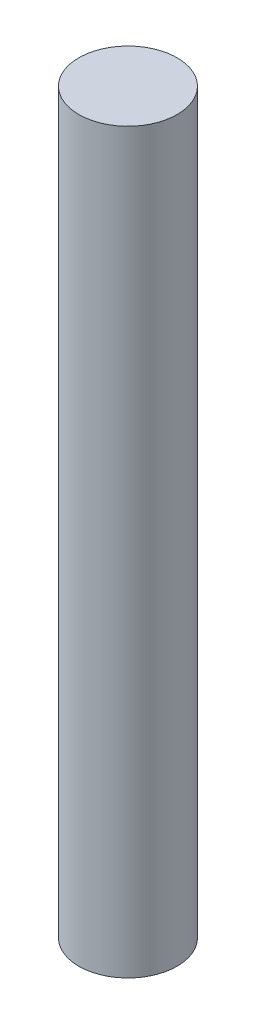
ISO-10303-21;
HEADER;
FILE_DESCRIPTION(('STEP AP214'),'2;1');
FILE_NAME('part.step','',(''),(''),'','','');
FILE_SCHEMA(('AUTOMOTIVE_DESIGN { 1 0 10303 214 1 1 1 1 }'));
ENDSEC;
DATA;
#1=APPLICATION_CONTEXT('core data for automotive mechanical design processes');
#2=APPLICATION_PROTOCOL_DEFINITION('international standard','automotive_design',2000,#1);
#3=PRODUCT_CONTEXT('',#1,'mechanical');
#4=PRODUCT('Part','Part','',(#3));
#5=PRODUCT_RELATED_PRODUCT_CATEGORY('part','',(#4));
#6=PRODUCT_DEFINITION_FORMATION('','',#4);
#7=PRODUCT_DEFINITION_CONTEXT('part definition',#1,'design');
#8=PRODUCT_DEFINITION('design','',#6,#7);
#9=PRODUCT_DEFINITION_SHAPE('','',#8);
#10=(LENGTH_UNIT() NAMED_UNIT(*) SI_UNIT(.MILLI.,.METRE.));
#11=(NAMED_UNIT(*) PLANE_ANGLE_UNIT() SI_UNIT($,.RADIAN.));
#12=(NAMED_UNIT(*) SI_UNIT($,.STERADIAN.) SOLID_ANGLE_UNIT());
#13=UNCERTAINTY_MEASURE_WITH_UNIT(LENGTH_MEASURE(1.E-05),#10,'distance_accuracy_value','');
#14=(GEOMETRIC_REPRESENTATION_CONTEXT(3) GLOBAL_UNCERTAINTY_ASSIGNED_CONTEXT((#13)) GLOBAL_UNIT_ASSIGNED_CONTEXT((#10,
#11,#12)) REPRESENTATION_CONTEXT('',''));
#15=CARTESIAN_POINT('',(0.,0.,0.));
#16=DIRECTION('',(0.,0.,1.));
#17=DIRECTION('',(1.,0.,0.));
#18=AXIS2_PLACEMENT_3D('',#15,#16,#17);
#19=CARTESIAN_POINT('',(0.,37.5,0.));
#20=DIRECTION('',(0.,-1.,0.));
#21=DIRECTION('',(0.,0.,-1.));
#22=AXIS2_PLACEMENT_3D('',#19,#20,#21);
#23=CYLINDRICAL_SURFACE('',#22,2.5);
#24=CARTESIAN_POINT('',(0.,37.5,0.));
#25=DIRECTION('',(0.,1.,0.));
#26=DIRECTION('',(0.,0.,1.));
#27=AXIS2_PLACEMENT_3D('',#24,#25,#26);
#28=CIRCLE('',#27,2.5);
#29=CARTESIAN_POINT('',(0.,37.5,2.5));
#30=VERTEX_POINT('',#29);
#31=EDGE_CURVE('E10',#30,#30,#28,.T.);
#32=ORIENTED_EDGE('',*,*,#31,.F.);
#33=EDGE_LOOP('',(#32));
#34=FACE_BOUND('',#33,.T.);
#35=CARTESIAN_POINT('',(0.,0.,0.));
#36=DIRECTION('',(0.,1.,0.));
#37=DIRECTION('',(0.,0.,1.));
#38=AXIS2_PLACEMENT_3D('',#35,#36,#37);
#39=CIRCLE('',#38,2.5);
#40=CARTESIAN_POINT('',(0.,0.,2.5));
#41=VERTEX_POINT('',#40);
#42=EDGE_CURVE('E33',#41,#41,#39,.T.);
#43=ORIENTED_EDGE('',*,*,#42,.T.);
#44=EDGE_LOOP('',(#43));
#45=FACE_BOUND('',#44,.T.);
#46=ADVANCED_FACE('F30',(#34,#45),#23,.T.);
#47=CARTESIAN_POINT('',(0.,37.5,0.));
#48=DIRECTION('',(0.,1.,0.));
#49=DIRECTION('',(0.,0.,1.));
#50=AXIS2_PLACEMENT_3D('',#47,#48,#49);
#51=PLANE('',#50);
#52=ORIENTED_EDGE('',*,*,#31,.T.);
#53=EDGE_LOOP('',(#52));
#54=FACE_BOUND('',#53,.T.);
#55=ADVANCED_FACE('F45',(#54),#51,.T.);
#56=CARTESIAN_POINT('',(0.,0.,0.));
#57=DIRECTION('',(0.,1.,0.));
#58=DIRECTION('',(0.,0.,1.));
#59=AXIS2_PLACEMENT_3D('',#56,#57,#58);
#60=PLANE('',#59);
#61=ORIENTED_EDGE('',*,*,#42,.F.);
#62=EDGE_LOOP('',(#61));
#63=FACE_BOUND('',#62,.T.);
#64=ADVANCED_FACE('F43',(#63),#60,.F.);
#65=CLOSED_SHELL('',(#46,#55,#64));
#66=MANIFOLD_SOLID_BREP('B2',#65);
#67=ADVANCED_BREP_SHAPE_REPRESENTATION('',(#18,#66),#14);
#68=SHAPE_DEFINITION_REPRESENTATION(#9,#67);
ENDSEC;
END-ISO-10303-21;
